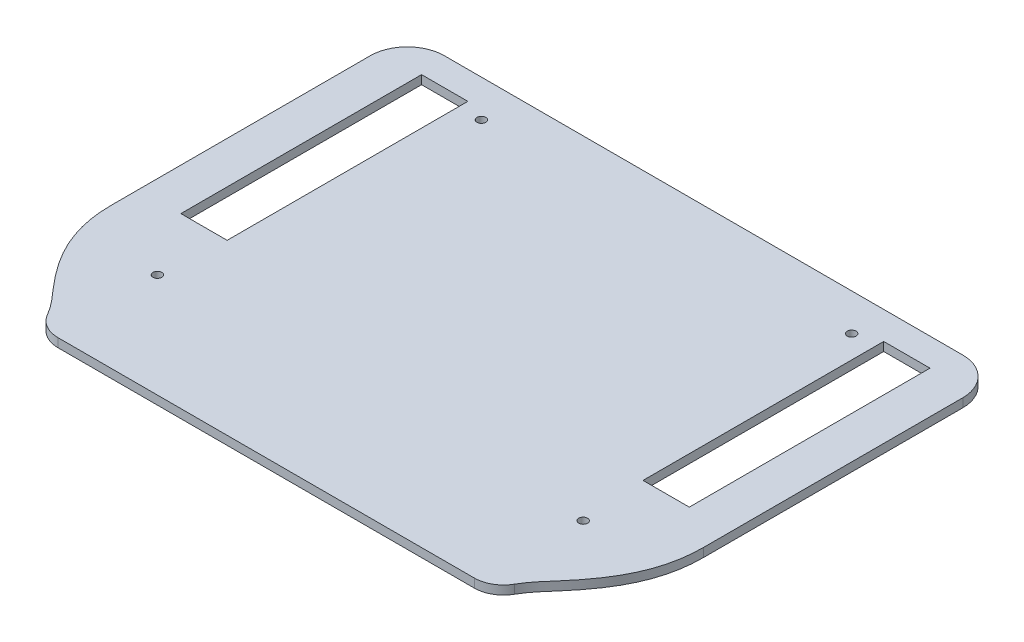
ISO-10303-21;
HEADER;
FILE_DESCRIPTION(('STEP AP214'),'2;1');
FILE_NAME('part.step','',(''),(''),'','','');
FILE_SCHEMA(('AUTOMOTIVE_DESIGN { 1 0 10303 214 1 1 1 1 }'));
ENDSEC;
DATA;
#1=APPLICATION_CONTEXT('core data for automotive mechanical design processes');
#2=APPLICATION_PROTOCOL_DEFINITION('international standard','automotive_design',2000,#1);
#3=PRODUCT_CONTEXT('',#1,'mechanical');
#4=PRODUCT('Part','Part','',(#3));
#5=PRODUCT_RELATED_PRODUCT_CATEGORY('part','',(#4));
#6=PRODUCT_DEFINITION_FORMATION('','',#4);
#7=PRODUCT_DEFINITION_CONTEXT('part definition',#1,'design');
#8=PRODUCT_DEFINITION('design','',#6,#7);
#9=PRODUCT_DEFINITION_SHAPE('','',#8);
#10=(LENGTH_UNIT() NAMED_UNIT(*) SI_UNIT(.MILLI.,.METRE.));
#11=(NAMED_UNIT(*) PLANE_ANGLE_UNIT() SI_UNIT($,.RADIAN.));
#12=(NAMED_UNIT(*) SI_UNIT($,.STERADIAN.) SOLID_ANGLE_UNIT());
#13=UNCERTAINTY_MEASURE_WITH_UNIT(LENGTH_MEASURE(1.E-05),#10,'distance_accuracy_value','');
#14=(GEOMETRIC_REPRESENTATION_CONTEXT(3) GLOBAL_UNCERTAINTY_ASSIGNED_CONTEXT((#13)) GLOBAL_UNIT_ASSIGNED_CONTEXT((#10,
#11,#12)) REPRESENTATION_CONTEXT('',''));
#15=CARTESIAN_POINT('',(0.,0.,0.));
#16=DIRECTION('',(0.,0.,1.));
#17=DIRECTION('',(1.,0.,0.));
#18=AXIS2_PLACEMENT_3D('',#15,#16,#17);
#19=CARTESIAN_POINT('',(0.,1.5,0.));
#20=DIRECTION('',(0.,-1.,0.));
#21=DIRECTION('',(0.,0.,-1.));
#22=AXIS2_PLACEMENT_3D('',#19,#20,#21);
#23=PLANE('',#22);
#24=CARTESIAN_POINT('',(-73.0249999993106,1.5,39.2999999999996));
#25=DIRECTION('',(0.,1.,0.));
#26=DIRECTION('',(0.,0.,-1.));
#27=AXIS2_PLACEMENT_3D('',#24,#25,#26);
#28=CIRCLE('',#27,1.5);
#29=CARTESIAN_POINT('',(-73.0249999993106,1.5,37.7999999999996));
#30=VERTEX_POINT('',#29);
#31=EDGE_CURVE('E306',#30,#30,#28,.T.);
#32=ORIENTED_EDGE('',*,*,#31,.F.);
#33=EDGE_LOOP('',(#32));
#34=FACE_BOUND('',#33,.T.);
#35=CARTESIAN_POINT('',(-63.4999999993099,1.5,-62.2999999999957));
#36=DIRECTION('',(0.,1.,0.));
#37=DIRECTION('',(0.,0.,-1.));
#38=AXIS2_PLACEMENT_3D('',#35,#36,#37);
#39=CIRCLE('',#38,1.50000000000001);
#40=CARTESIAN_POINT('',(-63.4999999993099,1.5,-63.7999999999958));
#41=VERTEX_POINT('',#40);
#42=EDGE_CURVE('E297',#41,#41,#39,.T.);
#43=ORIENTED_EDGE('',*,*,#42,.F.);
#44=EDGE_LOOP('',(#43));
#45=FACE_BOUND('',#44,.T.);
#46=DIRECTION('',(0.,0.,1.));
#47=VECTOR('',#46,1.);
#48=CARTESIAN_POINT('',(-87.1875,1.5,17.075));
#49=LINE('',#48,#47);
#50=CARTESIAN_POINT('',(-87.1875,1.5,-65.475));
#51=VERTEX_POINT('',#50);
#52=CARTESIAN_POINT('',(-87.1875,1.5,17.075));
#53=VERTEX_POINT('',#52);
#54=EDGE_CURVE('E313',#51,#53,#49,.T.);
#55=ORIENTED_EDGE('',*,*,#54,.F.);
#56=DIRECTION('',(-1.,0.,0.));
#57=VECTOR('',#56,1.);
#58=CARTESIAN_POINT('',(-87.1875,1.5,-65.475));
#59=LINE('',#58,#57);
#60=CARTESIAN_POINT('',(-71.3125,1.5,-65.475));
#61=VERTEX_POINT('',#60);
#62=EDGE_CURVE('E316',#61,#51,#59,.T.);
#63=ORIENTED_EDGE('',*,*,#62,.F.);
#64=DIRECTION('',(0.,0.,-1.));
#65=VECTOR('',#64,1.);
#66=CARTESIAN_POINT('',(-71.3125,1.5,-65.475));
#67=LINE('',#66,#65);
#68=CARTESIAN_POINT('',(-71.3125,1.5,17.075));
#69=VERTEX_POINT('',#68);
#70=EDGE_CURVE('E320',#69,#61,#67,.T.);
#71=ORIENTED_EDGE('',*,*,#70,.F.);
#72=DIRECTION('',(1.,0.,0.));
#73=VECTOR('',#72,1.);
#74=CARTESIAN_POINT('',(-71.3125,1.5,17.075));
#75=LINE('',#74,#73);
#76=EDGE_CURVE('E324',#53,#69,#75,.T.);
#77=ORIENTED_EDGE('',*,*,#76,.F.);
#78=EDGE_LOOP('',(#55,#63,#71,#77));
#79=FACE_BOUND('',#78,.T.);
#80=CARTESIAN_POINT('',(73.0249999993106,1.5,39.2999999999996));
#81=DIRECTION('',(0.,-1.,0.));
#82=DIRECTION('',(0.,0.,-1.));
#83=AXIS2_PLACEMENT_3D('',#80,#81,#82);
#84=CIRCLE('',#83,1.5);
#85=CARTESIAN_POINT('',(73.0249999993106,1.5,37.7999999999996));
#86=VERTEX_POINT('',#85);
#87=EDGE_CURVE('E606',#86,#86,#84,.T.);
#88=ORIENTED_EDGE('',*,*,#87,.T.);
#89=EDGE_LOOP('',(#88));
#90=FACE_BOUND('',#89,.T.);
#91=CARTESIAN_POINT('',(63.4999999993099,1.5,-62.2999999999957));
#92=DIRECTION('',(0.,-1.,0.));
#93=DIRECTION('',(0.,0.,-1.));
#94=AXIS2_PLACEMENT_3D('',#91,#92,#93);
#95=CIRCLE('',#94,1.50000000000001);
#96=CARTESIAN_POINT('',(63.4999999993099,1.5,-63.7999999999958));
#97=VERTEX_POINT('',#96);
#98=EDGE_CURVE('E610',#97,#97,#95,.T.);
#99=ORIENTED_EDGE('',*,*,#98,.T.);
#100=EDGE_LOOP('',(#99));
#101=FACE_BOUND('',#100,.T.);
#102=DIRECTION('',(1.,0.,0.));
#103=VECTOR('',#102,1.);
#104=CARTESIAN_POINT('',(87.1875,1.5,-65.475));
#105=LINE('',#104,#103);
#106=CARTESIAN_POINT('',(71.3125,1.5,-65.475));
#107=VERTEX_POINT('',#106);
#108=CARTESIAN_POINT('',(87.1875,1.5,-65.475));
#109=VERTEX_POINT('',#108);
#110=EDGE_CURVE('E615',#107,#109,#105,.T.);
#111=ORIENTED_EDGE('',*,*,#110,.T.);
#112=DIRECTION('',(0.,0.,1.));
#113=VECTOR('',#112,1.);
#114=CARTESIAN_POINT('',(87.1875,1.5,17.075));
#115=LINE('',#114,#113);
#116=CARTESIAN_POINT('',(87.1875,1.5,17.075));
#117=VERTEX_POINT('',#116);
#118=EDGE_CURVE('E618',#109,#117,#115,.T.);
#119=ORIENTED_EDGE('',*,*,#118,.T.);
#120=DIRECTION('',(-1.,0.,0.));
#121=VECTOR('',#120,1.);
#122=CARTESIAN_POINT('',(71.3125,1.5,17.075));
#123=LINE('',#122,#121);
#124=CARTESIAN_POINT('',(71.3125,1.5,17.075));
#125=VERTEX_POINT('',#124);
#126=EDGE_CURVE('E626',#117,#125,#123,.T.);
#127=ORIENTED_EDGE('',*,*,#126,.T.);
#128=DIRECTION('',(0.,0.,-1.));
#129=VECTOR('',#128,1.);
#130=CARTESIAN_POINT('',(71.3125,1.5,-65.475));
#131=LINE('',#130,#129);
#132=EDGE_CURVE('E619',#125,#107,#131,.T.);
#133=ORIENTED_EDGE('',*,*,#132,.T.);
#134=EDGE_LOOP('',(#111,#119,#127,#133));
#135=FACE_BOUND('',#134,.T.);
#136=DIRECTION('',(1.,0.,0.));
#137=VECTOR('',#136,1.);
#138=CARTESIAN_POINT('',(-101.6,1.5,75.));
#139=LINE('',#138,#137);
#140=CARTESIAN_POINT('',(-71.3864549990446,1.5,75.));
#141=VERTEX_POINT('',#140);
#142=CARTESIAN_POINT('',(71.3864549990446,1.5,75.));
#143=VERTEX_POINT('',#142);
#144=EDGE_CURVE('E206',#141,#143,#139,.T.);
#145=ORIENTED_EDGE('',*,*,#144,.T.);
#146=CARTESIAN_POINT('',(71.3864549990446,1.5,65.));
#147=DIRECTION('',(0.,-1.,0.));
#148=DIRECTION('',(0.,0.,-1.));
#149=AXIS2_PLACEMENT_3D('',#146,#147,#148);
#150=CIRCLE('',#149,10.);
#151=CARTESIAN_POINT('',(80.0718080037111,1.5,69.9562731143805));
#152=VERTEX_POINT('',#151);
#153=EDGE_CURVE('E49',#143,#152,#150,.F.);
#154=ORIENTED_EDGE('',*,*,#153,.T.);
#155=CARTESIAN_POINT('',(66.4896873195006,1.5,119.113824333768));
#156=CARTESIAN_POINT('',(72.7994178713068,1.5,97.8563222146831));
#157=CARTESIAN_POINT('',(74.1024601972933,1.5,75.1931447799472));
#158=CARTESIAN_POINT('',(92.8363642067102,1.5,54.8576559748796));
#159=CARTESIAN_POINT('',(101.6,1.5,41.84));
#160=CARTESIAN_POINT('',(101.6,1.5,26.6));
#161=B_SPLINE_CURVE_WITH_KNOTS('',3,(#155,#156,#157,#158,#159,#160),.UNSPECIFIED.,.F.,.F.,(4,1,
1,4),(0.0595105326349554,0.48461999716817,0.58461999716817,1.),.UNSPECIFIED.);
#162=CARTESIAN_POINT('',(101.6,1.5,26.6));
#163=VERTEX_POINT('',#162);
#164=EDGE_CURVE('E265',#152,#163,#161,.T.);
#165=ORIENTED_EDGE('',*,*,#164,.T.);
#166=DIRECTION('',(0.,0.,-1.));
#167=VECTOR('',#166,1.);
#168=CARTESIAN_POINT('',(101.6,1.5,75.));
#169=LINE('',#168,#167);
#170=CARTESIAN_POINT('',(101.6,1.5,-62.3));
#171=VERTEX_POINT('',#170);
#172=EDGE_CURVE('E196',#163,#171,#169,.T.);
#173=ORIENTED_EDGE('',*,*,#172,.T.);
#174=CARTESIAN_POINT('',(88.9,1.5,-62.3));
#175=DIRECTION('',(0.,-1.,0.));
#176=DIRECTION('',(0.,0.,-1.));
#177=AXIS2_PLACEMENT_3D('',#174,#175,#176);
#178=CIRCLE('',#177,12.7);
#179=CARTESIAN_POINT('',(88.9,1.5,-75.));
#180=VERTEX_POINT('',#179);
#181=EDGE_CURVE('E230',#171,#180,#178,.F.);
#182=ORIENTED_EDGE('',*,*,#181,.T.);
#183=DIRECTION('',(1.,0.,0.));
#184=VECTOR('',#183,1.);
#185=CARTESIAN_POINT('',(-101.6,1.5,-75.));
#186=LINE('',#185,#184);
#187=CARTESIAN_POINT('',(-88.9,1.5,-75.));
#188=VERTEX_POINT('',#187);
#189=EDGE_CURVE('E190',#188,#180,#186,.T.);
#190=ORIENTED_EDGE('',*,*,#189,.F.);
#191=CARTESIAN_POINT('',(-88.9,1.5,-62.3));
#192=DIRECTION('',(0.,-1.,0.));
#193=DIRECTION('',(0.,0.,-1.));
#194=AXIS2_PLACEMENT_3D('',#191,#192,#193);
#195=CIRCLE('',#194,12.7);
#196=CARTESIAN_POINT('',(-101.6,1.5,-62.3));
#197=VERTEX_POINT('',#196);
#198=EDGE_CURVE('E187',#188,#197,#195,.F.);
#199=ORIENTED_EDGE('',*,*,#198,.T.);
#200=DIRECTION('',(0.,0.,-1.));
#201=VECTOR('',#200,1.);
#202=CARTESIAN_POINT('',(-101.6,1.5,75.));
#203=LINE('',#202,#201);
#204=CARTESIAN_POINT('',(-101.6,1.5,26.6));
#205=VERTEX_POINT('',#204);
#206=EDGE_CURVE('E179',#205,#197,#203,.T.);
#207=ORIENTED_EDGE('',*,*,#206,.F.);
#208=CARTESIAN_POINT('',(-66.4896873195006,1.5,119.113824333768));
#209=CARTESIAN_POINT('',(-72.7994178713068,1.5,97.8563222146831));
#210=CARTESIAN_POINT('',(-74.1024601972933,1.5,75.1931447799472));
#211=CARTESIAN_POINT('',(-92.8363642067102,1.5,54.8576559748796));
#212=CARTESIAN_POINT('',(-101.6,1.5,41.84));
#213=CARTESIAN_POINT('',(-101.6,1.5,26.6));
#214=B_SPLINE_CURVE_WITH_KNOTS('',3,(#208,#209,#210,#211,#212,#213),.UNSPECIFIED.,.F.,.F.,(4,1,
1,4),(0.0595105326349554,0.48461999716817,0.58461999716817,1.),.UNSPECIFIED.);
#215=CARTESIAN_POINT('',(-80.0718080037111,1.5,69.9562731143805));
#216=VERTEX_POINT('',#215);
#217=EDGE_CURVE('E165',#216,#205,#214,.T.);
#218=ORIENTED_EDGE('',*,*,#217,.F.);
#219=CARTESIAN_POINT('',(-71.3864549990446,1.5,65.));
#220=DIRECTION('',(0.,-1.,0.));
#221=DIRECTION('',(0.,0.,-1.));
#222=AXIS2_PLACEMENT_3D('',#219,#220,#221);
#223=CIRCLE('',#222,10.);
#224=EDGE_CURVE('E260',#216,#141,#223,.F.);
#225=ORIENTED_EDGE('',*,*,#224,.T.);
#226=EDGE_LOOP('',(#145,#154,#165,#173,#182,#190,#199,#207,#218,#225));
#227=FACE_BOUND('',#226,.T.);
#228=ADVANCED_FACE('F40',(#34,#45,#79,#90,#101,#135,#227),#23,.F.);
#229=CARTESIAN_POINT('',(0.,-1.5,0.));
#230=DIRECTION('',(0.,-1.,0.));
#231=DIRECTION('',(0.,0.,-1.));
#232=AXIS2_PLACEMENT_3D('',#229,#230,#231);
#233=PLANE('',#232);
#234=CARTESIAN_POINT('',(-63.4999999993099,-1.5,-62.2999999999957));
#235=DIRECTION('',(0.,1.,0.));
#236=DIRECTION('',(0.,0.,-1.));
#237=AXIS2_PLACEMENT_3D('',#234,#235,#236);
#238=CIRCLE('',#237,1.50000000000001);
#239=CARTESIAN_POINT('',(-63.4999999993099,-1.5,-63.7999999999958));
#240=VERTEX_POINT('',#239);
#241=EDGE_CURVE('E302',#240,#240,#238,.T.);
#242=ORIENTED_EDGE('',*,*,#241,.T.);
#243=EDGE_LOOP('',(#242));
#244=FACE_BOUND('',#243,.T.);
#245=CARTESIAN_POINT('',(73.0249999993106,-1.5,39.2999999999996));
#246=DIRECTION('',(0.,-1.,0.));
#247=DIRECTION('',(0.,0.,-1.));
#248=AXIS2_PLACEMENT_3D('',#245,#246,#247);
#249=CIRCLE('',#248,1.5);
#250=CARTESIAN_POINT('',(73.0249999993106,-1.5,37.7999999999996));
#251=VERTEX_POINT('',#250);
#252=EDGE_CURVE('E661',#251,#251,#249,.T.);
#253=ORIENTED_EDGE('',*,*,#252,.F.);
#254=EDGE_LOOP('',(#253));
#255=FACE_BOUND('',#254,.T.);
#256=CARTESIAN_POINT('',(63.4999999993099,-1.5,-62.2999999999957));
#257=DIRECTION('',(0.,-1.,0.));
#258=DIRECTION('',(0.,0.,-1.));
#259=AXIS2_PLACEMENT_3D('',#256,#257,#258);
#260=CIRCLE('',#259,1.50000000000001);
#261=CARTESIAN_POINT('',(63.4999999993099,-1.5,-63.7999999999958));
#262=VERTEX_POINT('',#261);
#263=EDGE_CURVE('E667',#262,#262,#260,.T.);
#264=ORIENTED_EDGE('',*,*,#263,.F.);
#265=EDGE_LOOP('',(#264));
#266=FACE_BOUND('',#265,.T.);
#267=DIRECTION('',(0.,0.,1.));
#268=VECTOR('',#267,1.);
#269=CARTESIAN_POINT('',(87.1875,-1.5,17.075));
#270=LINE('',#269,#268);
#271=CARTESIAN_POINT('',(87.1875,-1.5,-65.475));
#272=VERTEX_POINT('',#271);
#273=CARTESIAN_POINT('',(87.1875,-1.5,17.075));
#274=VERTEX_POINT('',#273);
#275=EDGE_CURVE('E630',#272,#274,#270,.T.);
#276=ORIENTED_EDGE('',*,*,#275,.F.);
#277=DIRECTION('',(1.,0.,0.));
#278=VECTOR('',#277,1.);
#279=CARTESIAN_POINT('',(87.1875,-1.5,-65.475));
#280=LINE('',#279,#278);
#281=CARTESIAN_POINT('',(71.3125,-1.5,-65.475));
#282=VERTEX_POINT('',#281);
#283=EDGE_CURVE('E641',#282,#272,#280,.T.);
#284=ORIENTED_EDGE('',*,*,#283,.F.);
#285=DIRECTION('',(0.,0.,-1.));
#286=VECTOR('',#285,1.);
#287=CARTESIAN_POINT('',(71.3125,-1.5,-65.475));
#288=LINE('',#287,#286);
#289=CARTESIAN_POINT('',(71.3125,-1.5,17.075));
#290=VERTEX_POINT('',#289);
#291=EDGE_CURVE('E637',#290,#282,#288,.T.);
#292=ORIENTED_EDGE('',*,*,#291,.F.);
#293=DIRECTION('',(-1.,0.,0.));
#294=VECTOR('',#293,1.);
#295=CARTESIAN_POINT('',(71.3125,-1.5,17.075));
#296=LINE('',#295,#294);
#297=EDGE_CURVE('E633',#274,#290,#296,.T.);
#298=ORIENTED_EDGE('',*,*,#297,.F.);
#299=EDGE_LOOP('',(#276,#284,#292,#298));
#300=FACE_BOUND('',#299,.T.);
#301=DIRECTION('',(-1.,0.,0.));
#302=VECTOR('',#301,1.);
#303=CARTESIAN_POINT('',(-87.1875,-1.5,-65.475));
#304=LINE('',#303,#302);
#305=CARTESIAN_POINT('',(-71.3125,-1.5,-65.475));
#306=VERTEX_POINT('',#305);
#307=CARTESIAN_POINT('',(-87.1875,-1.5,-65.475));
#308=VERTEX_POINT('',#307);
#309=EDGE_CURVE('E331',#306,#308,#304,.T.);
#310=ORIENTED_EDGE('',*,*,#309,.T.);
#311=DIRECTION('',(0.,0.,1.));
#312=VECTOR('',#311,1.);
#313=CARTESIAN_POINT('',(-87.1875,-1.5,17.075));
#314=LINE('',#313,#312);
#315=CARTESIAN_POINT('',(-87.1875,-1.5,17.075));
#316=VERTEX_POINT('',#315);
#317=EDGE_CURVE('E301',#308,#316,#314,.T.);
#318=ORIENTED_EDGE('',*,*,#317,.T.);
#319=DIRECTION('',(1.,0.,0.));
#320=VECTOR('',#319,1.);
#321=CARTESIAN_POINT('',(-71.3125,-1.5,17.075));
#322=LINE('',#321,#320);
#323=CARTESIAN_POINT('',(-71.3125,-1.5,17.075));
#324=VERTEX_POINT('',#323);
#325=EDGE_CURVE('E317',#316,#324,#322,.T.);
#326=ORIENTED_EDGE('',*,*,#325,.T.);
#327=DIRECTION('',(0.,0.,-1.));
#328=VECTOR('',#327,1.);
#329=CARTESIAN_POINT('',(-71.3125,-1.5,-65.475));
#330=LINE('',#329,#328);
#331=EDGE_CURVE('E335',#324,#306,#330,.T.);
#332=ORIENTED_EDGE('',*,*,#331,.T.);
#333=EDGE_LOOP('',(#310,#318,#326,#332));
#334=FACE_BOUND('',#333,.T.);
#335=CARTESIAN_POINT('',(-73.0249999993106,-1.5,39.2999999999996));
#336=DIRECTION('',(0.,1.,0.));
#337=DIRECTION('',(0.,0.,-1.));
#338=AXIS2_PLACEMENT_3D('',#335,#336,#337);
#339=CIRCLE('',#338,1.5);
#340=CARTESIAN_POINT('',(-73.0249999993106,-1.5,37.7999999999996));
#341=VERTEX_POINT('',#340);
#342=EDGE_CURVE('E183',#341,#341,#339,.T.);
#343=ORIENTED_EDGE('',*,*,#342,.T.);
#344=EDGE_LOOP('',(#343));
#345=FACE_BOUND('',#344,.T.);
#346=CARTESIAN_POINT('',(66.4896873195006,-1.5,119.113824333768));
#347=CARTESIAN_POINT('',(72.7994178713068,-1.5,97.8563222146831));
#348=CARTESIAN_POINT('',(74.1024601972933,-1.5,75.1931447799472));
#349=CARTESIAN_POINT('',(92.8363642067102,-1.5,54.8576559748796));
#350=CARTESIAN_POINT('',(101.6,-1.5,41.84));
#351=CARTESIAN_POINT('',(101.6,-1.5,26.6));
#352=B_SPLINE_CURVE_WITH_KNOTS('',3,(#346,#347,#348,#349,#350,#351),.UNSPECIFIED.,.F.,.F.,(4,1,
1,4),(0.0595105326349554,0.48461999716817,0.58461999716817,1.),.UNSPECIFIED.);
#353=CARTESIAN_POINT('',(80.0718080037111,-1.5,69.9562731143805));
#354=VERTEX_POINT('',#353);
#355=CARTESIAN_POINT('',(101.6,-1.5,26.6));
#356=VERTEX_POINT('',#355);
#357=EDGE_CURVE('E276',#354,#356,#352,.T.);
#358=ORIENTED_EDGE('',*,*,#357,.F.);
#359=CARTESIAN_POINT('',(71.3864549990446,-1.5,65.));
#360=DIRECTION('',(0.,-1.,0.));
#361=DIRECTION('',(0.,0.,-1.));
#362=AXIS2_PLACEMENT_3D('',#359,#360,#361);
#363=CIRCLE('',#362,10.);
#364=CARTESIAN_POINT('',(71.3864549990446,-1.5,75.));
#365=VERTEX_POINT('',#364);
#366=EDGE_CURVE('E251',#354,#365,#363,.T.);
#367=ORIENTED_EDGE('',*,*,#366,.T.);
#368=DIRECTION('',(1.,0.,0.));
#369=VECTOR('',#368,1.);
#370=CARTESIAN_POINT('',(-101.6,-1.5,75.));
#371=LINE('',#370,#369);
#372=CARTESIAN_POINT('',(-71.3864549990446,-1.5,75.));
#373=VERTEX_POINT('',#372);
#374=EDGE_CURVE('E191',#373,#365,#371,.T.);
#375=ORIENTED_EDGE('',*,*,#374,.F.);
#376=CARTESIAN_POINT('',(-71.3864549990446,-1.5,65.));
#377=DIRECTION('',(0.,-1.,0.));
#378=DIRECTION('',(0.,0.,-1.));
#379=AXIS2_PLACEMENT_3D('',#376,#377,#378);
#380=CIRCLE('',#379,10.);
#381=CARTESIAN_POINT('',(-80.0718080037112,-1.5,69.9562731143805));
#382=VERTEX_POINT('',#381);
#383=EDGE_CURVE('E248',#373,#382,#380,.T.);
#384=ORIENTED_EDGE('',*,*,#383,.T.);
#385=CARTESIAN_POINT('',(-66.4896873195006,-1.5,119.113824333768));
#386=CARTESIAN_POINT('',(-72.7994178713068,-1.5,97.8563222146831));
#387=CARTESIAN_POINT('',(-74.1024601972933,-1.5,75.1931447799472));
#388=CARTESIAN_POINT('',(-92.8363642067102,-1.5,54.8576559748796));
#389=CARTESIAN_POINT('',(-101.6,-1.5,41.84));
#390=CARTESIAN_POINT('',(-101.6,-1.5,26.6));
#391=B_SPLINE_CURVE_WITH_KNOTS('',3,(#385,#386,#387,#388,#389,#390),.UNSPECIFIED.,.F.,.F.,(4,1,
1,4),(0.0595105326349554,0.48461999716817,0.58461999716817,1.),.UNSPECIFIED.);
#392=CARTESIAN_POINT('',(-101.6,-1.5,26.6));
#393=VERTEX_POINT('',#392);
#394=EDGE_CURVE('E174',#382,#393,#391,.T.);
#395=ORIENTED_EDGE('',*,*,#394,.T.);
#396=DIRECTION('',(0.,0.,-1.));
#397=VECTOR('',#396,1.);
#398=CARTESIAN_POINT('',(-101.6,-1.5,75.));
#399=LINE('',#398,#397);
#400=CARTESIAN_POINT('',(-101.6,-1.5,-62.3));
#401=VERTEX_POINT('',#400);
#402=EDGE_CURVE('E181',#393,#401,#399,.T.);
#403=ORIENTED_EDGE('',*,*,#402,.T.);
#404=CARTESIAN_POINT('',(-88.9,-1.5,-62.3));
#405=DIRECTION('',(0.,-1.,0.));
#406=DIRECTION('',(0.,0.,-1.));
#407=AXIS2_PLACEMENT_3D('',#404,#405,#406);
#408=CIRCLE('',#407,12.7);
#409=CARTESIAN_POINT('',(-88.9,-1.5,-75.));
#410=VERTEX_POINT('',#409);
#411=EDGE_CURVE('E209',#401,#410,#408,.T.);
#412=ORIENTED_EDGE('',*,*,#411,.T.);
#413=DIRECTION('',(1.,0.,0.));
#414=VECTOR('',#413,1.);
#415=CARTESIAN_POINT('',(-101.6,-1.5,-75.));
#416=LINE('',#415,#414);
#417=CARTESIAN_POINT('',(88.9,-1.5,-75.));
#418=VERTEX_POINT('',#417);
#419=EDGE_CURVE('E212',#410,#418,#416,.T.);
#420=ORIENTED_EDGE('',*,*,#419,.T.);
#421=CARTESIAN_POINT('',(88.9,-1.5,-62.3));
#422=DIRECTION('',(0.,-1.,0.));
#423=DIRECTION('',(0.,0.,-1.));
#424=AXIS2_PLACEMENT_3D('',#421,#422,#423);
#425=CIRCLE('',#424,12.7);
#426=CARTESIAN_POINT('',(101.6,-1.5,-62.3));
#427=VERTEX_POINT('',#426);
#428=EDGE_CURVE('E221',#418,#427,#425,.T.);
#429=ORIENTED_EDGE('',*,*,#428,.T.);
#430=DIRECTION('',(0.,0.,-1.));
#431=VECTOR('',#430,1.);
#432=CARTESIAN_POINT('',(101.6,-1.5,75.));
#433=LINE('',#432,#431);
#434=EDGE_CURVE('E198',#356,#427,#433,.T.);
#435=ORIENTED_EDGE('',*,*,#434,.F.);
#436=EDGE_LOOP('',(#358,#367,#375,#384,#395,#403,#412,#420,#429,#435));
#437=FACE_BOUND('',#436,.T.);
#438=ADVANCED_FACE('F281',(#244,#255,#266,#300,#334,#345,#437),#233,.T.);
#439=CARTESIAN_POINT('',(-101.6,1.5,75.));
#440=DIRECTION('',(0.,0.,-1.));
#441=DIRECTION('',(-1.,0.,0.));
#442=AXIS2_PLACEMENT_3D('',#439,#440,#441);
#443=PLANE('',#442);
#444=ORIENTED_EDGE('',*,*,#374,.T.);
#445=DIRECTION('',(0.,-1.,0.));
#446=VECTOR('',#445,1.);
#447=CARTESIAN_POINT('',(71.3864549990446,1.5,75.));
#448=LINE('',#447,#446);
#449=EDGE_CURVE('E62',#365,#143,#448,.F.);
#450=ORIENTED_EDGE('',*,*,#449,.T.);
#451=ORIENTED_EDGE('',*,*,#144,.F.);
#452=DIRECTION('',(0.,1.,0.));
#453=VECTOR('',#452,1.);
#454=CARTESIAN_POINT('',(-71.3864549990446,-1.5,75.));
#455=LINE('',#454,#453);
#456=EDGE_CURVE('E254',#141,#373,#455,.F.);
#457=ORIENTED_EDGE('',*,*,#456,.T.);
#458=EDGE_LOOP('',(#444,#450,#451,#457));
#459=FACE_BOUND('',#458,.T.);
#460=ADVANCED_FACE('F283',(#459),#443,.F.);
#461=CARTESIAN_POINT('',(-101.6,1.5,75.));
#462=DIRECTION('',(-1.,0.,0.));
#463=DIRECTION('',(0.,0.,1.));
#464=AXIS2_PLACEMENT_3D('',#461,#462,#463);
#465=PLANE('',#464);
#466=DIRECTION('',(0.,-1.,0.));
#467=VECTOR('',#466,1.);
#468=CARTESIAN_POINT('',(-101.6,1.5,26.6));
#469=LINE('',#468,#467);
#470=EDGE_CURVE('E168',#205,#393,#469,.T.);
#471=ORIENTED_EDGE('',*,*,#470,.F.);
#472=ORIENTED_EDGE('',*,*,#206,.T.);
#473=DIRECTION('',(0.,-1.,0.));
#474=VECTOR('',#473,1.);
#475=CARTESIAN_POINT('',(-101.6,1.5,-62.3));
#476=LINE('',#475,#474);
#477=EDGE_CURVE('E225',#197,#401,#476,.T.);
#478=ORIENTED_EDGE('',*,*,#477,.T.);
#479=ORIENTED_EDGE('',*,*,#402,.F.);
#480=EDGE_LOOP('',(#471,#472,#478,#479));
#481=FACE_BOUND('',#480,.T.);
#482=ADVANCED_FACE('F177',(#481),#465,.T.);
#483=CARTESIAN_POINT('',(101.6,1.5,75.));
#484=DIRECTION('',(-1.,0.,0.));
#485=DIRECTION('',(0.,0.,1.));
#486=AXIS2_PLACEMENT_3D('',#483,#484,#485);
#487=PLANE('',#486);
#488=ORIENTED_EDGE('',*,*,#172,.F.);
#489=DIRECTION('',(0.,-1.,0.));
#490=VECTOR('',#489,1.);
#491=CARTESIAN_POINT('',(101.6,1.5,26.6));
#492=LINE('',#491,#490);
#493=EDGE_CURVE('E273',#163,#356,#492,.T.);
#494=ORIENTED_EDGE('',*,*,#493,.T.);
#495=ORIENTED_EDGE('',*,*,#434,.T.);
#496=DIRECTION('',(0.,-1.,0.));
#497=VECTOR('',#496,1.);
#498=CARTESIAN_POINT('',(101.6,1.5,-62.3));
#499=LINE('',#498,#497);
#500=EDGE_CURVE('E233',#427,#171,#499,.F.);
#501=ORIENTED_EDGE('',*,*,#500,.T.);
#502=EDGE_LOOP('',(#488,#494,#495,#501));
#503=FACE_BOUND('',#502,.T.);
#504=ADVANCED_FACE('F403',(#503),#487,.F.);
#505=CARTESIAN_POINT('',(-101.6,1.5,-75.));
#506=DIRECTION('',(0.,0.,-1.));
#507=DIRECTION('',(-1.,0.,0.));
#508=AXIS2_PLACEMENT_3D('',#505,#506,#507);
#509=PLANE('',#508);
#510=ORIENTED_EDGE('',*,*,#189,.T.);
#511=DIRECTION('',(0.,-1.,0.));
#512=VECTOR('',#511,1.);
#513=CARTESIAN_POINT('',(88.9,-1.5,-75.));
#514=LINE('',#513,#512);
#515=EDGE_CURVE('E240',#180,#418,#514,.T.);
#516=ORIENTED_EDGE('',*,*,#515,.T.);
#517=ORIENTED_EDGE('',*,*,#419,.F.);
#518=DIRECTION('',(0.,-1.,0.));
#519=VECTOR('',#518,1.);
#520=CARTESIAN_POINT('',(-88.9,1.5,-75.));
#521=LINE('',#520,#519);
#522=EDGE_CURVE('E237',#410,#188,#521,.F.);
#523=ORIENTED_EDGE('',*,*,#522,.T.);
#524=EDGE_LOOP('',(#510,#516,#517,#523));
#525=FACE_BOUND('',#524,.T.);
#526=ADVANCED_FACE('F406',(#525),#509,.T.);
#527=CARTESIAN_POINT('',(88.9,1.5,-62.3));
#528=DIRECTION('',(0.,1.,0.));
#529=DIRECTION('',(0.,0.,1.));
#530=AXIS2_PLACEMENT_3D('',#527,#528,#529);
#531=CYLINDRICAL_SURFACE('',#530,12.7);
#532=ORIENTED_EDGE('',*,*,#181,.F.);
#533=ORIENTED_EDGE('',*,*,#500,.F.);
#534=ORIENTED_EDGE('',*,*,#428,.F.);
#535=ORIENTED_EDGE('',*,*,#515,.F.);
#536=EDGE_LOOP('',(#532,#533,#534,#535));
#537=FACE_BOUND('',#536,.T.);
#538=ADVANCED_FACE('F410',(#537),#531,.T.);
#539=CARTESIAN_POINT('',(-88.9,1.5,-62.3));
#540=DIRECTION('',(0.,-1.,0.));
#541=DIRECTION('',(0.,0.,-1.));
#542=AXIS2_PLACEMENT_3D('',#539,#540,#541);
#543=CYLINDRICAL_SURFACE('',#542,12.7);
#544=ORIENTED_EDGE('',*,*,#198,.F.);
#545=ORIENTED_EDGE('',*,*,#522,.F.);
#546=ORIENTED_EDGE('',*,*,#411,.F.);
#547=ORIENTED_EDGE('',*,*,#477,.F.);
#548=EDGE_LOOP('',(#544,#545,#546,#547));
#549=FACE_BOUND('',#548,.T.);
#550=ADVANCED_FACE('F393',(#549),#543,.T.);
#551=CARTESIAN_POINT('',(87.1875,1.5,17.075));
#552=DIRECTION('',(1.,0.,0.));
#553=DIRECTION('',(0.,0.,-1.));
#554=AXIS2_PLACEMENT_3D('',#551,#552,#553);
#555=PLANE('',#554);
#556=ORIENTED_EDGE('',*,*,#275,.T.);
#557=DIRECTION('',(0.,-1.,0.));
#558=VECTOR('',#557,1.);
#559=CARTESIAN_POINT('',(87.1875,1.5,17.075));
#560=LINE('',#559,#558);
#561=EDGE_CURVE('E201',#117,#274,#560,.T.);
#562=ORIENTED_EDGE('',*,*,#561,.F.);
#563=ORIENTED_EDGE('',*,*,#118,.F.);
#564=DIRECTION('',(0.,-1.,0.));
#565=VECTOR('',#564,1.);
#566=CARTESIAN_POINT('',(87.1875,1.5,-65.475));
#567=LINE('',#566,#565);
#568=EDGE_CURVE('E213',#109,#272,#567,.T.);
#569=ORIENTED_EDGE('',*,*,#568,.T.);
#570=EDGE_LOOP('',(#556,#562,#563,#569));
#571=FACE_BOUND('',#570,.T.);
#572=ADVANCED_FACE('F383',(#571),#555,.F.);
#573=CARTESIAN_POINT('',(87.1875,1.5,-65.475));
#574=DIRECTION('',(0.,0.,-1.));
#575=DIRECTION('',(-1.,0.,0.));
#576=AXIS2_PLACEMENT_3D('',#573,#574,#575);
#577=PLANE('',#576);
#578=ORIENTED_EDGE('',*,*,#283,.T.);
#579=ORIENTED_EDGE('',*,*,#568,.F.);
#580=ORIENTED_EDGE('',*,*,#110,.F.);
#581=DIRECTION('',(0.,-1.,0.));
#582=VECTOR('',#581,1.);
#583=CARTESIAN_POINT('',(71.3125,1.5,-65.475));
#584=LINE('',#583,#582);
#585=EDGE_CURVE('E647',#107,#282,#584,.T.);
#586=ORIENTED_EDGE('',*,*,#585,.T.);
#587=EDGE_LOOP('',(#578,#579,#580,#586));
#588=FACE_BOUND('',#587,.T.);
#589=ADVANCED_FACE('F379',(#588),#577,.F.);
#590=CARTESIAN_POINT('',(71.3125,1.5,-65.475));
#591=DIRECTION('',(-1.,0.,0.));
#592=DIRECTION('',(0.,0.,1.));
#593=AXIS2_PLACEMENT_3D('',#590,#591,#592);
#594=PLANE('',#593);
#595=ORIENTED_EDGE('',*,*,#291,.T.);
#596=ORIENTED_EDGE('',*,*,#585,.F.);
#597=ORIENTED_EDGE('',*,*,#132,.F.);
#598=DIRECTION('',(0.,-1.,0.));
#599=VECTOR('',#598,1.);
#600=CARTESIAN_POINT('',(71.3125,1.5,17.075));
#601=LINE('',#600,#599);
#602=EDGE_CURVE('E625',#125,#290,#601,.T.);
#603=ORIENTED_EDGE('',*,*,#602,.T.);
#604=EDGE_LOOP('',(#595,#596,#597,#603));
#605=FACE_BOUND('',#604,.T.);
#606=ADVANCED_FACE('F382',(#605),#594,.F.);
#607=CARTESIAN_POINT('',(71.3125,1.5,17.075));
#608=DIRECTION('',(0.,0.,1.));
#609=DIRECTION('',(1.,0.,0.));
#610=AXIS2_PLACEMENT_3D('',#607,#608,#609);
#611=PLANE('',#610);
#612=ORIENTED_EDGE('',*,*,#297,.T.);
#613=ORIENTED_EDGE('',*,*,#602,.F.);
#614=ORIENTED_EDGE('',*,*,#126,.F.);
#615=ORIENTED_EDGE('',*,*,#561,.T.);
#616=EDGE_LOOP('',(#612,#613,#614,#615));
#617=FACE_BOUND('',#616,.T.);
#618=ADVANCED_FACE('F374',(#617),#611,.F.);
#619=CARTESIAN_POINT('',(63.4999999993099,1.5,-62.2999999999957));
#620=DIRECTION('',(0.,-1.,0.));
#621=DIRECTION('',(0.,0.,-1.));
#622=AXIS2_PLACEMENT_3D('',#619,#620,#621);
#623=CYLINDRICAL_SURFACE('',#622,1.50000000000001);
#624=ORIENTED_EDGE('',*,*,#98,.F.);
#625=EDGE_LOOP('',(#624));
#626=FACE_BOUND('',#625,.T.);
#627=ORIENTED_EDGE('',*,*,#263,.T.);
#628=EDGE_LOOP('',(#627));
#629=FACE_BOUND('',#628,.T.);
#630=ADVANCED_FACE('F371',(#626,#629),#623,.F.);
#631=CARTESIAN_POINT('',(73.0249999993106,1.5,39.2999999999996));
#632=DIRECTION('',(0.,-1.,0.));
#633=DIRECTION('',(0.,0.,-1.));
#634=AXIS2_PLACEMENT_3D('',#631,#632,#633);
#635=CYLINDRICAL_SURFACE('',#634,1.5);
#636=ORIENTED_EDGE('',*,*,#87,.F.);
#637=EDGE_LOOP('',(#636));
#638=FACE_BOUND('',#637,.T.);
#639=ORIENTED_EDGE('',*,*,#252,.T.);
#640=EDGE_LOOP('',(#639));
#641=FACE_BOUND('',#640,.T.);
#642=ADVANCED_FACE('F369',(#638,#641),#635,.F.);
#643=DIRECTION('',(0.,-1.,0.));
#644=VECTOR('',#643,1.);
#645=SURFACE_OF_LINEAR_EXTRUSION('',#161,#644);
#646=ORIENTED_EDGE('',*,*,#164,.F.);
#647=DIRECTION('',(0.,-1.,0.));
#648=VECTOR('',#647,1.);
#649=CARTESIAN_POINT('',(80.0718080037111,1.5,69.9562731143805));
#650=LINE('',#649,#648);
#651=EDGE_CURVE('E244',#152,#354,#650,.T.);
#652=ORIENTED_EDGE('',*,*,#651,.T.);
#653=ORIENTED_EDGE('',*,*,#357,.T.);
#654=ORIENTED_EDGE('',*,*,#493,.F.);
#655=EDGE_LOOP('',(#646,#652,#653,#654));
#656=FACE_BOUND('',#655,.T.);
#657=ADVANCED_FACE('F270',(#656),#645,.F.);
#658=CARTESIAN_POINT('',(-87.1875,1.5,17.075));
#659=DIRECTION('',(1.,0.,0.));
#660=DIRECTION('',(0.,0.,-1.));
#661=AXIS2_PLACEMENT_3D('',#658,#659,#660);
#662=PLANE('',#661);
#663=ORIENTED_EDGE('',*,*,#317,.F.);
#664=DIRECTION('',(0.,-1.,0.));
#665=VECTOR('',#664,1.);
#666=CARTESIAN_POINT('',(-87.1875,1.5,-65.475));
#667=LINE('',#666,#665);
#668=EDGE_CURVE('E327',#51,#308,#667,.T.);
#669=ORIENTED_EDGE('',*,*,#668,.F.);
#670=ORIENTED_EDGE('',*,*,#54,.T.);
#671=DIRECTION('',(0.,-1.,0.));
#672=VECTOR('',#671,1.);
#673=CARTESIAN_POINT('',(-87.1875,1.5,17.075));
#674=LINE('',#673,#672);
#675=EDGE_CURVE('E342',#53,#316,#674,.T.);
#676=ORIENTED_EDGE('',*,*,#675,.T.);
#677=EDGE_LOOP('',(#663,#669,#670,#676));
#678=FACE_BOUND('',#677,.T.);
#679=ADVANCED_FACE('F368',(#678),#662,.T.);
#680=CARTESIAN_POINT('',(-71.3125,1.5,17.075));
#681=DIRECTION('',(0.,0.,-1.));
#682=DIRECTION('',(-1.,0.,0.));
#683=AXIS2_PLACEMENT_3D('',#680,#681,#682);
#684=PLANE('',#683);
#685=ORIENTED_EDGE('',*,*,#325,.F.);
#686=ORIENTED_EDGE('',*,*,#675,.F.);
#687=ORIENTED_EDGE('',*,*,#76,.T.);
#688=DIRECTION('',(0.,-1.,0.));
#689=VECTOR('',#688,1.);
#690=CARTESIAN_POINT('',(-71.3125,1.5,17.075));
#691=LINE('',#690,#689);
#692=EDGE_CURVE('E346',#69,#324,#691,.T.);
#693=ORIENTED_EDGE('',*,*,#692,.T.);
#694=EDGE_LOOP('',(#685,#686,#687,#693));
#695=FACE_BOUND('',#694,.T.);
#696=ADVANCED_FACE('F437',(#695),#684,.T.);
#697=CARTESIAN_POINT('',(-71.3125,1.5,-65.475));
#698=DIRECTION('',(-1.,0.,0.));
#699=DIRECTION('',(0.,0.,1.));
#700=AXIS2_PLACEMENT_3D('',#697,#698,#699);
#701=PLANE('',#700);
#702=ORIENTED_EDGE('',*,*,#331,.F.);
#703=ORIENTED_EDGE('',*,*,#692,.F.);
#704=ORIENTED_EDGE('',*,*,#70,.T.);
#705=DIRECTION('',(0.,-1.,0.));
#706=VECTOR('',#705,1.);
#707=CARTESIAN_POINT('',(-71.3125,1.5,-65.475));
#708=LINE('',#707,#706);
#709=EDGE_CURVE('E349',#61,#306,#708,.T.);
#710=ORIENTED_EDGE('',*,*,#709,.T.);
#711=EDGE_LOOP('',(#702,#703,#704,#710));
#712=FACE_BOUND('',#711,.T.);
#713=ADVANCED_FACE('F440',(#712),#701,.T.);
#714=CARTESIAN_POINT('',(-87.1875,1.5,-65.475));
#715=DIRECTION('',(0.,0.,1.));
#716=DIRECTION('',(1.,0.,0.));
#717=AXIS2_PLACEMENT_3D('',#714,#715,#716);
#718=PLANE('',#717);
#719=ORIENTED_EDGE('',*,*,#309,.F.);
#720=ORIENTED_EDGE('',*,*,#709,.F.);
#721=ORIENTED_EDGE('',*,*,#62,.T.);
#722=ORIENTED_EDGE('',*,*,#668,.T.);
#723=EDGE_LOOP('',(#719,#720,#721,#722));
#724=FACE_BOUND('',#723,.T.);
#725=ADVANCED_FACE('F434',(#724),#718,.T.);
#726=CARTESIAN_POINT('',(-63.4999999993099,1.5,-62.2999999999957));
#727=DIRECTION('',(0.,-1.,0.));
#728=DIRECTION('',(0.,0.,-1.));
#729=AXIS2_PLACEMENT_3D('',#726,#727,#728);
#730=CYLINDRICAL_SURFACE('',#729,1.50000000000001);
#731=ORIENTED_EDGE('',*,*,#42,.T.);
#732=EDGE_LOOP('',(#731));
#733=FACE_BOUND('',#732,.T.);
#734=ORIENTED_EDGE('',*,*,#241,.F.);
#735=EDGE_LOOP('',(#734));
#736=FACE_BOUND('',#735,.T.);
#737=ADVANCED_FACE('F429',(#733,#736),#730,.F.);
#738=CARTESIAN_POINT('',(-73.0249999993106,1.5,39.2999999999996));
#739=DIRECTION('',(0.,-1.,0.));
#740=DIRECTION('',(0.,0.,-1.));
#741=AXIS2_PLACEMENT_3D('',#738,#739,#740);
#742=CYLINDRICAL_SURFACE('',#741,1.5);
#743=ORIENTED_EDGE('',*,*,#31,.T.);
#744=EDGE_LOOP('',(#743));
#745=FACE_BOUND('',#744,.T.);
#746=ORIENTED_EDGE('',*,*,#342,.F.);
#747=EDGE_LOOP('',(#746));
#748=FACE_BOUND('',#747,.T.);
#749=ADVANCED_FACE('F424',(#745,#748),#742,.F.);
#750=DIRECTION('',(0.,-1.,0.));
#751=VECTOR('',#750,1.);
#752=SURFACE_OF_LINEAR_EXTRUSION('',#214,#751);
#753=ORIENTED_EDGE('',*,*,#394,.F.);
#754=DIRECTION('',(0.,-1.,0.));
#755=VECTOR('',#754,1.);
#756=CARTESIAN_POINT('',(-80.0718080037112,-1.5,69.9562731143805));
#757=LINE('',#756,#755);
#758=EDGE_CURVE('E11',#382,#216,#757,.F.);
#759=ORIENTED_EDGE('',*,*,#758,.T.);
#760=ORIENTED_EDGE('',*,*,#217,.T.);
#761=ORIENTED_EDGE('',*,*,#470,.T.);
#762=EDGE_LOOP('',(#753,#759,#760,#761));
#763=FACE_BOUND('',#762,.T.);
#764=ADVANCED_FACE('F167',(#763),#752,.T.);
#765=CARTESIAN_POINT('',(71.3864549990446,0.,65.));
#766=DIRECTION('',(0.,-1.,0.));
#767=DIRECTION('',(0.,0.,-1.));
#768=AXIS2_PLACEMENT_3D('',#765,#766,#767);
#769=CYLINDRICAL_SURFACE('',#768,10.);
#770=ORIENTED_EDGE('',*,*,#153,.F.);
#771=ORIENTED_EDGE('',*,*,#449,.F.);
#772=ORIENTED_EDGE('',*,*,#366,.F.);
#773=ORIENTED_EDGE('',*,*,#651,.F.);
#774=EDGE_LOOP('',(#770,#771,#772,#773));
#775=FACE_BOUND('',#774,.T.);
#776=ADVANCED_FACE('F278',(#775),#769,.T.);
#777=CARTESIAN_POINT('',(-71.3864549990446,0.,65.));
#778=DIRECTION('',(0.,-1.,0.));
#779=DIRECTION('',(0.,0.,-1.));
#780=AXIS2_PLACEMENT_3D('',#777,#778,#779);
#781=CYLINDRICAL_SURFACE('',#780,10.);
#782=ORIENTED_EDGE('',*,*,#224,.F.);
#783=ORIENTED_EDGE('',*,*,#758,.F.);
#784=ORIENTED_EDGE('',*,*,#383,.F.);
#785=ORIENTED_EDGE('',*,*,#456,.F.);
#786=EDGE_LOOP('',(#782,#783,#784,#785));
#787=FACE_BOUND('',#786,.T.);
#788=ADVANCED_FACE('F42',(#787),#781,.T.);
#789=CLOSED_SHELL('',(#228,#438,#460,#482,#504,#526,#538,#550,#572,#589,#606,#618,#630,#642,
#657,#679,#696,#713,#725,#737,#749,#764,#776,#788));
#790=MANIFOLD_SOLID_BREP('B2',#789);
#791=ADVANCED_BREP_SHAPE_REPRESENTATION('',(#18,#790),#14);
#792=SHAPE_DEFINITION_REPRESENTATION(#9,#791);
ENDSEC;
END-ISO-10303-21;
